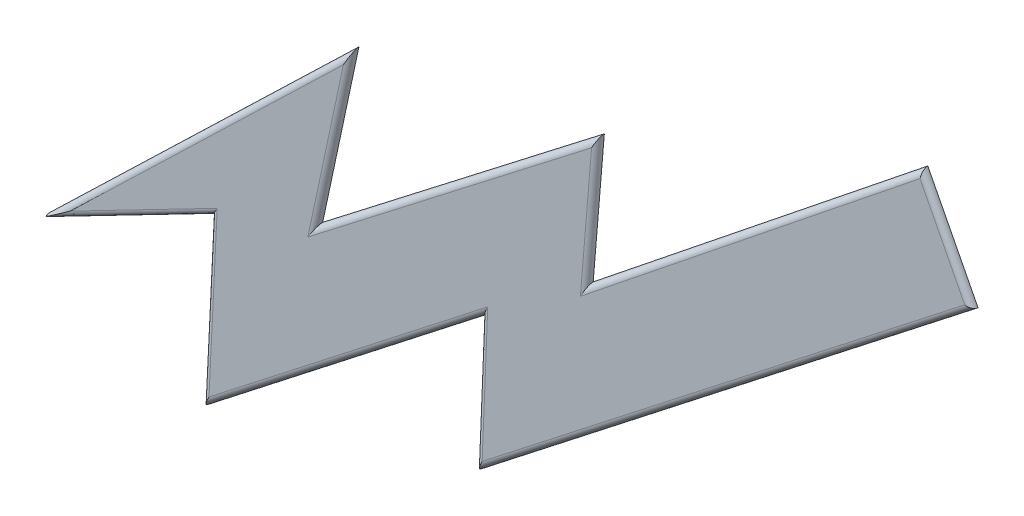
ISO-10303-21;
HEADER;
FILE_DESCRIPTION(('STEP AP214'),'2;1');
FILE_NAME('part.step','',(''),(''),'','','');
FILE_SCHEMA(('AUTOMOTIVE_DESIGN { 1 0 10303 214 1 1 1 1 }'));
ENDSEC;
DATA;
#1=APPLICATION_CONTEXT('core data for automotive mechanical design processes');
#2=APPLICATION_PROTOCOL_DEFINITION('international standard','automotive_design',2000,#1);
#3=PRODUCT_CONTEXT('',#1,'mechanical');
#4=PRODUCT('Part','Part','',(#3));
#5=PRODUCT_RELATED_PRODUCT_CATEGORY('part','',(#4));
#6=PRODUCT_DEFINITION_FORMATION('','',#4);
#7=PRODUCT_DEFINITION_CONTEXT('part definition',#1,'design');
#8=PRODUCT_DEFINITION('design','',#6,#7);
#9=PRODUCT_DEFINITION_SHAPE('','',#8);
#10=(LENGTH_UNIT() NAMED_UNIT(*) SI_UNIT(.MILLI.,.METRE.));
#11=(NAMED_UNIT(*) PLANE_ANGLE_UNIT() SI_UNIT($,.RADIAN.));
#12=(NAMED_UNIT(*) SI_UNIT($,.STERADIAN.) SOLID_ANGLE_UNIT());
#13=UNCERTAINTY_MEASURE_WITH_UNIT(LENGTH_MEASURE(1.E-05),#10,'distance_accuracy_value','');
#14=(GEOMETRIC_REPRESENTATION_CONTEXT(3) GLOBAL_UNCERTAINTY_ASSIGNED_CONTEXT((#13)) GLOBAL_UNIT_ASSIGNED_CONTEXT((#10,
#11,#12)) REPRESENTATION_CONTEXT('',''));
#15=CARTESIAN_POINT('',(0.,0.,0.));
#16=DIRECTION('',(0.,0.,1.));
#17=DIRECTION('',(1.,0.,0.));
#18=AXIS2_PLACEMENT_3D('',#15,#16,#17);
#19=CARTESIAN_POINT('',(1.38672,23.4506,0.5));
#20=DIRECTION('',(1.,0.,0.));
#21=DIRECTION('',(0.,0.,-1.));
#22=AXIS2_PLACEMENT_3D('',#19,#20,#21);
#23=PLANE('',#22);
#24=DIRECTION('',(0.,-1.,0.));
#25=VECTOR('',#24,1.);
#26=CARTESIAN_POINT('',(1.38672,23.4506,0.));
#27=LINE('',#26,#25);
#28=CARTESIAN_POINT('',(1.38672,23.6888,0.));
#29=VERTEX_POINT('',#28);
#30=CARTESIAN_POINT('',(1.38672,23.4506,0.));
#31=VERTEX_POINT('',#30);
#32=EDGE_CURVE('E162',#29,#31,#27,.T.);
#33=ORIENTED_EDGE('',*,*,#32,.T.);
#34=CARTESIAN_POINT('',(1.38672,24.0133927911735,0.));
#35=DIRECTION('',(1.,0.,0.));
#36=DIRECTION('',(0.,1.,0.));
#37=AXIS2_PLACEMENT_3D('',#34,#35,#36);
#38=ELLIPSE('',#37,0.562792791173522,0.5);
#39=CARTESIAN_POINT('',(1.38672,23.5572255570632,0.292840209101451));
#40=VERTEX_POINT('',#39);
#41=EDGE_CURVE('E11',#31,#40,#38,.F.);
#42=ORIENTED_EDGE('',*,*,#41,.T.);
#43=CARTESIAN_POINT('',(1.38672,22.9943215838772,0.));
#44=DIRECTION('',(1.,0.,0.));
#45=DIRECTION('',(0.,-1.,0.));
#46=AXIS2_PLACEMENT_3D('',#43,#44,#45);
#47=ELLIPSE('',#46,0.694478416122833,0.5);
#48=EDGE_CURVE('E42',#40,#29,#47,.F.);
#49=ORIENTED_EDGE('',*,*,#48,.T.);
#50=EDGE_LOOP('',(#33,#42,#49));
#51=FACE_BOUND('',#50,.T.);
#52=ADVANCED_FACE('F33',(#51),#23,.F.);
#53=CARTESIAN_POINT('',(0.,0.,0.5));
#54=DIRECTION('',(0.,0.,-1.));
#55=DIRECTION('',(-1.,0.,0.));
#56=AXIS2_PLACEMENT_3D('',#53,#54,#55);
#57=PLANE('',#56);
#58=DIRECTION('',(-0.0407851579899783,-0.999167939281347,0.));
#59=VECTOR('',#58,1.);
#60=CARTESIAN_POINT('',(37.8260053639462,-1.54402432688936,0.5));
#61=LINE('',#60,#59);
#62=CARTESIAN_POINT('',(39.3565077349434,35.9507158055443,0.5));
#63=VERTEX_POINT('',#62);
#64=CARTESIAN_POINT('',(38.8797405951598,24.2707208257122,0.5));
#65=VERTEX_POINT('',#64);
#66=EDGE_CURVE('E56',#63,#65,#61,.T.);
#67=ORIENTED_EDGE('',*,*,#66,.T.);
#68=DIRECTION('',(0.788157525524168,0.615473569667798,0.));
#69=VECTOR('',#68,1.);
#70=CARTESIAN_POINT('',(2.95445867702482,-3.78339372298983,0.5));
#71=LINE('',#70,#69);
#72=CARTESIAN_POINT('',(80.1342865269948,56.4864668249706,0.5));
#73=VERTEX_POINT('',#72);
#74=EDGE_CURVE('E196',#65,#73,#71,.T.);
#75=ORIENTED_EDGE('',*,*,#74,.T.);
#76=DIRECTION('',(-0.457331636140397,0.88929622431738,0.));
#77=VECTOR('',#76,1.);
#78=CARTESIAN_POINT('',(86.3472544772861,44.4051487980175,0.5));
#79=LINE('',#78,#77);
#80=CARTESIAN_POINT('',(76.312352916692,63.9183408976196,0.5));
#81=VERTEX_POINT('',#80);
#82=EDGE_CURVE('E178',#73,#81,#79,.T.);
#83=ORIENTED_EDGE('',*,*,#82,.T.);
#84=DIRECTION('',(-0.780861618853134,-0.62470403568575,0.));
#85=VECTOR('',#84,1.);
#86=CARTESIAN_POINT('',(-1.39855260406927,1.74814950453458,0.5));
#87=LINE('',#86,#85);
#88=CARTESIAN_POINT('',(47.2769944699866,40.6895060294396,0.5));
#89=VERTEX_POINT('',#88);
#90=EDGE_CURVE('E139',#81,#89,#87,.T.);
#91=ORIENTED_EDGE('',*,*,#90,.T.);
#92=DIRECTION('',(0.0830152081606633,0.996548280423002,0.));
#93=VECTOR('',#92,1.);
#94=CARTESIAN_POINT('',(43.5849954612267,-3.63074980106282,0.5));
#95=LINE('',#94,#93);
#96=CARTESIAN_POINT('',(48.2324265299624,52.1589005840756,0.5));
#97=VERTEX_POINT('',#96);
#98=EDGE_CURVE('E181',#89,#97,#95,.T.);
#99=ORIENTED_EDGE('',*,*,#98,.T.);
#100=DIRECTION('',(-0.791457463227993,-0.61122425009215,0.));
#101=VECTOR('',#100,1.);
#102=CARTESIAN_POINT('',(-7.2128877026228,9.33976981902398,0.5));
#103=LINE('',#102,#101);
#104=CARTESIAN_POINT('',(23.9751973830914,33.425604881564,0.5));
#105=VERTEX_POINT('',#104);
#106=EDGE_CURVE('E183',#97,#105,#103,.T.);
#107=ORIENTED_EDGE('',*,*,#106,.T.);
#108=DIRECTION('',(0.208433889060402,0.978036458365002,0.));
#109=VECTOR('',#108,1.);
#110=CARTESIAN_POINT('',(16.1195942662775,-3.43532155090897,0.5));
#111=LINE('',#110,#109);
#112=CARTESIAN_POINT('',(27.01752661417,47.7011572869705,0.5));
#113=VERTEX_POINT('',#112);
#114=EDGE_CURVE('E185',#105,#113,#111,.T.);
#115=ORIENTED_EDGE('',*,*,#114,.T.);
#116=DIRECTION('',(-0.719964779886787,-0.694010602024616,0.));
#117=VECTOR('',#116,1.);
#118=CARTESIAN_POINT('',(-10.8215014014695,11.2261971961593,0.5));
#119=LINE('',#118,#117);
#120=CARTESIAN_POINT('',(3.66506570361863,25.1905346731302,0.5));
#121=VERTEX_POINT('',#120);
#122=EDGE_CURVE('E187',#113,#121,#119,.T.);
#123=ORIENTED_EDGE('',*,*,#122,.T.);
#124=DIRECTION('',(0.888426447249638,0.459019005954422,0.));
#125=VECTOR('',#124,1.);
#126=CARTESIAN_POINT('',(-9.50059288293029,18.3882973738675,0.5));
#127=LINE('',#126,#125);
#128=CARTESIAN_POINT('',(16.2316588725867,31.6832557335069,0.5));
#129=VERTEX_POINT('',#128);
#130=EDGE_CURVE('E189',#121,#129,#127,.T.);
#131=ORIENTED_EDGE('',*,*,#130,.T.);
#132=DIRECTION('',(-0.0491239920494458,-0.998792687901311,0.));
#133=VECTOR('',#132,1.);
#134=CARTESIAN_POINT('',(14.6379602430749,-0.719944239992236,0.5));
#135=LINE('',#134,#133);
#136=CARTESIAN_POINT('',(15.5274066533159,17.3643468317641,0.5));
#137=VERTEX_POINT('',#136);
#138=EDGE_CURVE('E191',#129,#137,#135,.T.);
#139=ORIENTED_EDGE('',*,*,#138,.T.);
#140=DIRECTION('',(0.78850759947054,0.615025012155772,0.));
#141=VECTOR('',#140,1.);
#142=CARTESIAN_POINT('',(-2.54754182690639,3.26613723146592,0.5));
#143=LINE('',#142,#141);
#144=EDGE_CURVE('E193',#137,#63,#143,.T.);
#145=ORIENTED_EDGE('',*,*,#144,.T.);
#146=EDGE_LOOP('',(#67,#75,#83,#91,#99,#107,#115,#123,#131,#139,#145));
#147=FACE_BOUND('',#146,.T.);
#148=ADVANCED_FACE('F232',(#147),#57,.F.);
#149=CARTESIAN_POINT('',(0.,0.,0.));
#150=DIRECTION('',(0.,0.,-1.));
#151=DIRECTION('',(-1.,0.,0.));
#152=AXIS2_PLACEMENT_3D('',#149,#150,#151);
#153=PLANE('',#152);
#154=DIRECTION('',(-0.457331636140397,0.88929622431738,0.));
#155=VECTOR('',#154,1.);
#156=CARTESIAN_POINT('',(76.4774,64.6907,0.));
#157=LINE('',#156,#155);
#158=CARTESIAN_POINT('',(80.7682,56.3471,0.));
#159=VERTEX_POINT('',#158);
#160=CARTESIAN_POINT('',(76.4774,64.6907,0.));
#161=VERTEX_POINT('',#160);
#162=EDGE_CURVE('E127',#159,#161,#157,.T.);
#163=ORIENTED_EDGE('',*,*,#162,.F.);
#164=DIRECTION('',(0.788157525524168,0.615473569667798,0.));
#165=VECTOR('',#164,1.);
#166=CARTESIAN_POINT('',(80.7682,56.3471,0.));
#167=LINE('',#166,#165);
#168=CARTESIAN_POINT('',(38.3361,23.2118,0.));
#169=VERTEX_POINT('',#168);
#170=EDGE_CURVE('E176',#169,#159,#167,.T.);
#171=ORIENTED_EDGE('',*,*,#170,.F.);
#172=DIRECTION('',(-0.0407851579899783,-0.999167939281346,0.));
#173=VECTOR('',#172,1.);
#174=CARTESIAN_POINT('',(38.3361,23.2118,0.));
#175=LINE('',#174,#173);
#176=CARTESIAN_POINT('',(38.8129,34.8926,0.));
#177=VERTEX_POINT('',#176);
#178=EDGE_CURVE('E173',#177,#169,#175,.T.);
#179=ORIENTED_EDGE('',*,*,#178,.F.);
#180=DIRECTION('',(0.788507599470539,0.615025012155772,0.));
#181=VECTOR('',#180,1.);
#182=CARTESIAN_POINT('',(38.8129,34.8926,0.));
#183=LINE('',#182,#181);
#184=CARTESIAN_POINT('',(14.9744,16.2989,0.));
#185=VERTEX_POINT('',#184);
#186=EDGE_CURVE('E170',#185,#177,#183,.T.);
#187=ORIENTED_EDGE('',*,*,#186,.F.);
#188=DIRECTION('',(-0.0491239920494457,-0.998792687901311,0.));
#189=VECTOR('',#188,1.);
#190=CARTESIAN_POINT('',(14.9744,16.2989,0.));
#191=LINE('',#190,#189);
#192=CARTESIAN_POINT('',(15.6896,30.8404,0.));
#193=VERTEX_POINT('',#192);
#194=EDGE_CURVE('E167',#193,#185,#191,.T.);
#195=ORIENTED_EDGE('',*,*,#194,.F.);
#196=DIRECTION('',(0.888426447249638,0.459019005954422,0.));
#197=VECTOR('',#196,1.);
#198=CARTESIAN_POINT('',(15.6896,30.8404,0.));
#199=LINE('',#198,#197);
#200=EDGE_CURVE('E164',#31,#193,#199,.T.);
#201=ORIENTED_EDGE('',*,*,#200,.F.);
#202=ORIENTED_EDGE('',*,*,#32,.F.);
#203=DIRECTION('',(-0.719964779886787,-0.694010602024616,0.));
#204=VECTOR('',#203,1.);
#205=CARTESIAN_POINT('',(1.38672,23.6888,0.));
#206=LINE('',#205,#204);
#207=CARTESIAN_POINT('',(27.8472,49.1954,0.));
#208=VERTEX_POINT('',#207);
#209=EDGE_CURVE('E159',#208,#29,#206,.T.);
#210=ORIENTED_EDGE('',*,*,#209,.F.);
#211=DIRECTION('',(0.208433889060402,0.978036458365002,0.));
#212=VECTOR('',#211,1.);
#213=CARTESIAN_POINT('',(27.8472,49.1954,0.));
#214=LINE('',#213,#212);
#215=CARTESIAN_POINT('',(24.7483,34.6544,0.));
#216=VERTEX_POINT('',#215);
#217=EDGE_CURVE('E156',#216,#208,#214,.T.);
#218=ORIENTED_EDGE('',*,*,#217,.F.);
#219=DIRECTION('',(-0.791457463227993,-0.61122425009215,0.));
#220=VECTOR('',#219,1.);
#221=CARTESIAN_POINT('',(24.7483,34.6544,0.));
#222=LINE('',#221,#220);
#223=CARTESIAN_POINT('',(48.8249,53.2482,0.));
#224=VERTEX_POINT('',#223);
#225=EDGE_CURVE('E153',#224,#216,#222,.T.);
#226=ORIENTED_EDGE('',*,*,#225,.F.);
#227=DIRECTION('',(0.0830152081606633,0.996548280423002,0.));
#228=VECTOR('',#227,1.);
#229=CARTESIAN_POINT('',(48.8249,53.2482,0.));
#230=LINE('',#229,#228);
#231=CARTESIAN_POINT('',(47.8717,41.8056,0.));
#232=VERTEX_POINT('',#231);
#233=EDGE_CURVE('E130',#232,#224,#230,.T.);
#234=ORIENTED_EDGE('',*,*,#233,.F.);
#235=DIRECTION('',(-0.780861618853134,-0.62470403568575,0.));
#236=VECTOR('',#235,1.);
#237=CARTESIAN_POINT('',(47.8717,41.8056,0.));
#238=LINE('',#237,#236);
#239=EDGE_CURVE('E122',#161,#232,#238,.T.);
#240=ORIENTED_EDGE('',*,*,#239,.F.);
#241=EDGE_LOOP('',(#163,#171,#179,#187,#195,#201,#202,#210,#218,#226,#234,#240));
#242=FACE_BOUND('',#241,.T.);
#243=ADVANCED_FACE('F124',(#242),#153,.T.);
#244=CARTESIAN_POINT('',(-10.8215014014695,11.2261971961593,0.));
#245=DIRECTION('',(-0.719964779886787,-0.694010602024616,0.));
#246=DIRECTION('',(0.694010602024616,-0.719964779886787,0.));
#247=AXIS2_PLACEMENT_3D('',#244,#245,#246);
#248=CYLINDRICAL_SURFACE('',#247,0.5);
#249=CARTESIAN_POINT('',(3.66506570361864,25.1905346731302,0.));
#250=DIRECTION('',(0.582635522914404,-0.81273356485275,0.));
#251=DIRECTION('',(-0.81273356485275,-0.582635522914404,0.));
#252=AXIS2_PLACEMENT_3D('',#249,#250,#251);
#253=ELLIPSE('',#252,3.4585643846173,0.5);
#254=EDGE_CURVE('E150',#121,#40,#253,.T.);
#255=ORIENTED_EDGE('',*,*,#254,.F.);
#256=ORIENTED_EDGE('',*,*,#122,.F.);
#257=CARTESIAN_POINT('',(27.01752661417,47.7011572869705,0.));
#258=DIRECTION('',(-0.874271871963636,0.48543660131185,0.));
#259=DIRECTION('',(0.48543660131185,0.874271871963635,0.));
#260=AXIS2_PLACEMENT_3D('',#257,#258,#259);
#261=ELLIPSE('',#260,1.70912820250452,0.5);
#262=EDGE_CURVE('E37',#208,#113,#261,.F.);
#263=ORIENTED_EDGE('',*,*,#262,.F.);
#264=ORIENTED_EDGE('',*,*,#209,.T.);
#265=ORIENTED_EDGE('',*,*,#48,.F.);
#266=EDGE_LOOP('',(#255,#256,#263,#264,#265));
#267=FACE_BOUND('',#266,.T.);
#268=ADVANCED_FACE('F35',(#267),#248,.T.);
#269=CARTESIAN_POINT('',(16.1195942662775,-3.43532155090897,0.));
#270=DIRECTION('',(0.208433889060402,0.978036458365002,0.));
#271=DIRECTION('',(-0.978036458365002,0.208433889060402,0.));
#272=AXIS2_PLACEMENT_3D('',#269,#270,#271);
#273=CYLINDRICAL_SURFACE('',#272,0.5);
#274=ORIENTED_EDGE('',*,*,#262,.T.);
#275=ORIENTED_EDGE('',*,*,#114,.F.);
#276=CARTESIAN_POINT('',(23.9751973830914,33.425604881564,0.));
#277=DIRECTION('',(-0.84641391875974,0.532525565705329,0.));
#278=DIRECTION('',(0.532525565705328,0.84641391875974,0.));
#279=AXIS2_PLACEMENT_3D('',#276,#277,#278);
#280=ELLIPSE('',#279,1.45176619996576,0.5);
#281=EDGE_CURVE('E214',#216,#105,#280,.F.);
#282=ORIENTED_EDGE('',*,*,#281,.F.);
#283=ORIENTED_EDGE('',*,*,#217,.T.);
#284=EDGE_LOOP('',(#274,#275,#282,#283));
#285=FACE_BOUND('',#284,.T.);
#286=ADVANCED_FACE('F238',(#285),#273,.T.);
#287=CARTESIAN_POINT('',(-9.50059288293029,18.3882973738675,0.));
#288=DIRECTION('',(0.888426447249638,0.459019005954422,0.));
#289=DIRECTION('',(-0.459019005954422,0.888426447249638,0.));
#290=AXIS2_PLACEMENT_3D('',#287,#288,#289);
#291=CYLINDRICAL_SURFACE('',#290,0.5);
#292=ORIENTED_EDGE('',*,*,#41,.F.);
#293=ORIENTED_EDGE('',*,*,#200,.T.);
#294=CARTESIAN_POINT('',(16.2316588725867,31.6832557335069,0.));
#295=DIRECTION('',(0.841077217924667,-0.54091507049453,0.));
#296=DIRECTION('',(-0.54091507049453,-0.841077217924667,0.));
#297=AXIS2_PLACEMENT_3D('',#294,#295,#296);
#298=ELLIPSE('',#297,1.00211456872725,0.5);
#299=EDGE_CURVE('E211',#129,#193,#298,.T.);
#300=ORIENTED_EDGE('',*,*,#299,.F.);
#301=ORIENTED_EDGE('',*,*,#130,.F.);
#302=ORIENTED_EDGE('',*,*,#254,.T.);
#303=EDGE_LOOP('',(#292,#293,#300,#301,#302));
#304=FACE_BOUND('',#303,.T.);
#305=ADVANCED_FACE('F220',(#304),#291,.T.);
#306=CARTESIAN_POINT('',(-7.2128877026228,9.33976981902399,0.));
#307=DIRECTION('',(-0.791457463227993,-0.61122425009215,0.));
#308=DIRECTION('',(0.61122425009215,-0.791457463227993,0.));
#309=AXIS2_PLACEMENT_3D('',#306,#307,#308);
#310=CYLINDRICAL_SURFACE('',#309,0.5);
#311=ORIENTED_EDGE('',*,*,#281,.T.);
#312=ORIENTED_EDGE('',*,*,#106,.F.);
#313=CARTESIAN_POINT('',(48.2324265299623,52.1589005840756,0.));
#314=DIRECTION('',(-0.878467833594944,0.47780149156214,0.));
#315=DIRECTION('',(0.47780149156214,0.878467833594944,0.));
#316=AXIS2_PLACEMENT_3D('',#313,#314,#315);
#317=ELLIPSE('',#316,1.23999920573831,0.5);
#318=EDGE_CURVE('E208',#224,#97,#317,.F.);
#319=ORIENTED_EDGE('',*,*,#318,.F.);
#320=ORIENTED_EDGE('',*,*,#225,.T.);
#321=EDGE_LOOP('',(#311,#312,#319,#320));
#322=FACE_BOUND('',#321,.T.);
#323=ADVANCED_FACE('F240',(#322),#310,.T.);
#324=CARTESIAN_POINT('',(14.6379602430749,-0.719944239992236,0.));
#325=DIRECTION('',(-0.0491239920494458,-0.998792687901311,0.));
#326=DIRECTION('',(0.998792687901311,-0.0491239920494458,0.));
#327=AXIS2_PLACEMENT_3D('',#324,#325,#326);
#328=CYLINDRICAL_SURFACE('',#327,0.5);
#329=ORIENTED_EDGE('',*,*,#299,.T.);
#330=ORIENTED_EDGE('',*,*,#194,.T.);
#331=CARTESIAN_POINT('',(15.5274066533159,17.3643468317641,0.));
#332=DIRECTION('',(0.887566291600318,-0.46068001694762,0.));
#333=DIRECTION('',(-0.46068001694762,-0.887566291600318,0.));
#334=AXIS2_PLACEMENT_3D('',#331,#332,#333);
#335=ELLIPSE('',#334,1.20041380778791,0.5);
#336=EDGE_CURVE('E205',#137,#185,#335,.T.);
#337=ORIENTED_EDGE('',*,*,#336,.F.);
#338=ORIENTED_EDGE('',*,*,#138,.F.);
#339=EDGE_LOOP('',(#329,#330,#337,#338));
#340=FACE_BOUND('',#339,.T.);
#341=ADVANCED_FACE('F229',(#340),#328,.T.);
#342=CARTESIAN_POINT('',(43.5849954612268,-3.63074980106282,0.));
#343=DIRECTION('',(0.0830152081606633,0.996548280423002,0.));
#344=DIRECTION('',(-0.996548280423002,0.0830152081606633,0.));
#345=AXIS2_PLACEMENT_3D('',#342,#343,#344);
#346=CYLINDRICAL_SURFACE('',#345,0.5);
#347=ORIENTED_EDGE('',*,*,#318,.T.);
#348=ORIENTED_EDGE('',*,*,#98,.F.);
#349=CARTESIAN_POINT('',(47.2769944699866,40.6895060294396,0.));
#350=DIRECTION('',(-0.882531682916307,0.47025294113797,0.));
#351=DIRECTION('',(0.47025294113797,0.882531682916307,0.));
#352=AXIS2_PLACEMENT_3D('',#349,#350,#351);
#353=ELLIPSE('',#352,1.26465031473125,0.5);
#354=EDGE_CURVE('E203',#232,#89,#353,.F.);
#355=ORIENTED_EDGE('',*,*,#354,.F.);
#356=ORIENTED_EDGE('',*,*,#233,.T.);
#357=EDGE_LOOP('',(#347,#348,#355,#356));
#358=FACE_BOUND('',#357,.T.);
#359=ADVANCED_FACE('F244',(#358),#346,.T.);
#360=CARTESIAN_POINT('',(-2.54754182690639,3.26613723146592,0.));
#361=DIRECTION('',(0.78850759947054,0.615025012155772,0.));
#362=DIRECTION('',(-0.615025012155772,0.78850759947054,0.));
#363=AXIS2_PLACEMENT_3D('',#360,#361,#362);
#364=CYLINDRICAL_SURFACE('',#363,0.5);
#365=ORIENTED_EDGE('',*,*,#336,.T.);
#366=ORIENTED_EDGE('',*,*,#186,.T.);
#367=CARTESIAN_POINT('',(39.3565077349434,35.9507158055443,0.));
#368=DIRECTION('',(0.889481272141652,-0.456971625496888,0.));
#369=DIRECTION('',(-0.456971625496888,-0.889481272141652,0.));
#370=AXIS2_PLACEMENT_3D('',#367,#368,#369);
#371=ELLIPSE('',#370,1.18958750305848,0.5);
#372=EDGE_CURVE('E142',#63,#177,#371,.T.);
#373=ORIENTED_EDGE('',*,*,#372,.F.);
#374=ORIENTED_EDGE('',*,*,#144,.F.);
#375=EDGE_LOOP('',(#365,#366,#373,#374));
#376=FACE_BOUND('',#375,.T.);
#377=ADVANCED_FACE('F250',(#376),#364,.T.);
#378=CARTESIAN_POINT('',(-1.39855260406927,1.74814950453458,0.));
#379=DIRECTION('',(-0.780861618853134,-0.62470403568575,0.));
#380=DIRECTION('',(0.62470403568575,-0.780861618853134,0.));
#381=AXIS2_PLACEMENT_3D('',#378,#379,#380);
#382=CYLINDRICAL_SURFACE('',#381,0.5);
#383=ORIENTED_EDGE('',*,*,#354,.T.);
#384=ORIENTED_EDGE('',*,*,#90,.F.);
#385=CARTESIAN_POINT('',(76.312352916692,63.9183408976196,0.));
#386=DIRECTION('',(-0.977921178316665,0.208974086909705,0.));
#387=DIRECTION('',(0.208974086909705,0.977921178316665,0.));
#388=AXIS2_PLACEMENT_3D('',#385,#386,#387);
#389=ELLIPSE('',#388,0.789796887014842,0.5);
#390=EDGE_CURVE('E137',#161,#81,#389,.F.);
#391=ORIENTED_EDGE('',*,*,#390,.F.);
#392=ORIENTED_EDGE('',*,*,#239,.T.);
#393=EDGE_LOOP('',(#383,#384,#391,#392));
#394=FACE_BOUND('',#393,.T.);
#395=ADVANCED_FACE('F138',(#394),#382,.T.);
#396=CARTESIAN_POINT('',(37.8260053639462,-1.54402432688936,0.));
#397=DIRECTION('',(-0.0407851579899783,-0.999167939281347,0.));
#398=DIRECTION('',(0.999167939281347,-0.0407851579899783,0.));
#399=AXIS2_PLACEMENT_3D('',#396,#397,#398);
#400=CYLINDRICAL_SURFACE('',#399,0.5);
#401=ORIENTED_EDGE('',*,*,#372,.T.);
#402=ORIENTED_EDGE('',*,*,#178,.T.);
#403=CARTESIAN_POINT('',(38.8797405951598,24.2707208257122,0.));
#404=DIRECTION('',(0.88961124348999,-0.456718551688228,0.));
#405=DIRECTION('',(-0.456718551688228,-0.88961124348999,0.));
#406=AXIS2_PLACEMENT_3D('',#403,#404,#405);
#407=ELLIPSE('',#406,1.19031861777964,0.5);
#408=EDGE_CURVE('E143',#65,#169,#407,.T.);
#409=ORIENTED_EDGE('',*,*,#408,.F.);
#410=ORIENTED_EDGE('',*,*,#66,.F.);
#411=EDGE_LOOP('',(#401,#402,#409,#410));
#412=FACE_BOUND('',#411,.T.);
#413=ADVANCED_FACE('F251',(#412),#400,.T.);
#414=CARTESIAN_POINT('',(86.347254477286,44.4051487980175,0.));
#415=DIRECTION('',(-0.457331636140397,0.88929622431738,0.));
#416=DIRECTION('',(-0.88929622431738,-0.457331636140397,0.));
#417=AXIS2_PLACEMENT_3D('',#414,#415,#416);
#418=CYLINDRICAL_SURFACE('',#417,0.5);
#419=ORIENTED_EDGE('',*,*,#390,.T.);
#420=ORIENTED_EDGE('',*,*,#82,.F.);
#421=CARTESIAN_POINT('',(80.1342865269948,56.4864668249706,0.));
#422=DIRECTION('',(0.214723435659634,0.97667489277575,0.));
#423=DIRECTION('',(-0.97667489277575,0.214723435659634,0.));
#424=AXIS2_PLACEMENT_3D('',#421,#422,#423);
#425=ELLIPSE('',#424,0.649052696751149,0.5);
#426=EDGE_CURVE('E147',#159,#73,#425,.F.);
#427=ORIENTED_EDGE('',*,*,#426,.F.);
#428=ORIENTED_EDGE('',*,*,#162,.T.);
#429=EDGE_LOOP('',(#419,#420,#427,#428));
#430=FACE_BOUND('',#429,.T.);
#431=ADVANCED_FACE('F146',(#430),#418,.T.);
#432=CARTESIAN_POINT('',(2.95445867702482,-3.78339372298983,0.));
#433=DIRECTION('',(0.788157525524168,0.615473569667798,0.));
#434=DIRECTION('',(-0.615473569667798,0.788157525524168,0.));
#435=AXIS2_PLACEMENT_3D('',#432,#433,#434);
#436=CYLINDRICAL_SURFACE('',#435,0.5);
#437=ORIENTED_EDGE('',*,*,#408,.T.);
#438=ORIENTED_EDGE('',*,*,#170,.T.);
#439=ORIENTED_EDGE('',*,*,#426,.T.);
#440=ORIENTED_EDGE('',*,*,#74,.F.);
#441=EDGE_LOOP('',(#437,#438,#439,#440));
#442=FACE_BOUND('',#441,.T.);
#443=ADVANCED_FACE('F247',(#442),#436,.T.);
#444=CLOSED_SHELL('',(#52,#148,#243,#268,#286,#305,#323,#341,#359,#377,#395,#413,#431,#443));
#445=MANIFOLD_SOLID_BREP('B2',#444);
#446=ADVANCED_BREP_SHAPE_REPRESENTATION('',(#18,#445),#14);
#447=SHAPE_DEFINITION_REPRESENTATION(#9,#446);
ENDSEC;
END-ISO-10303-21;
